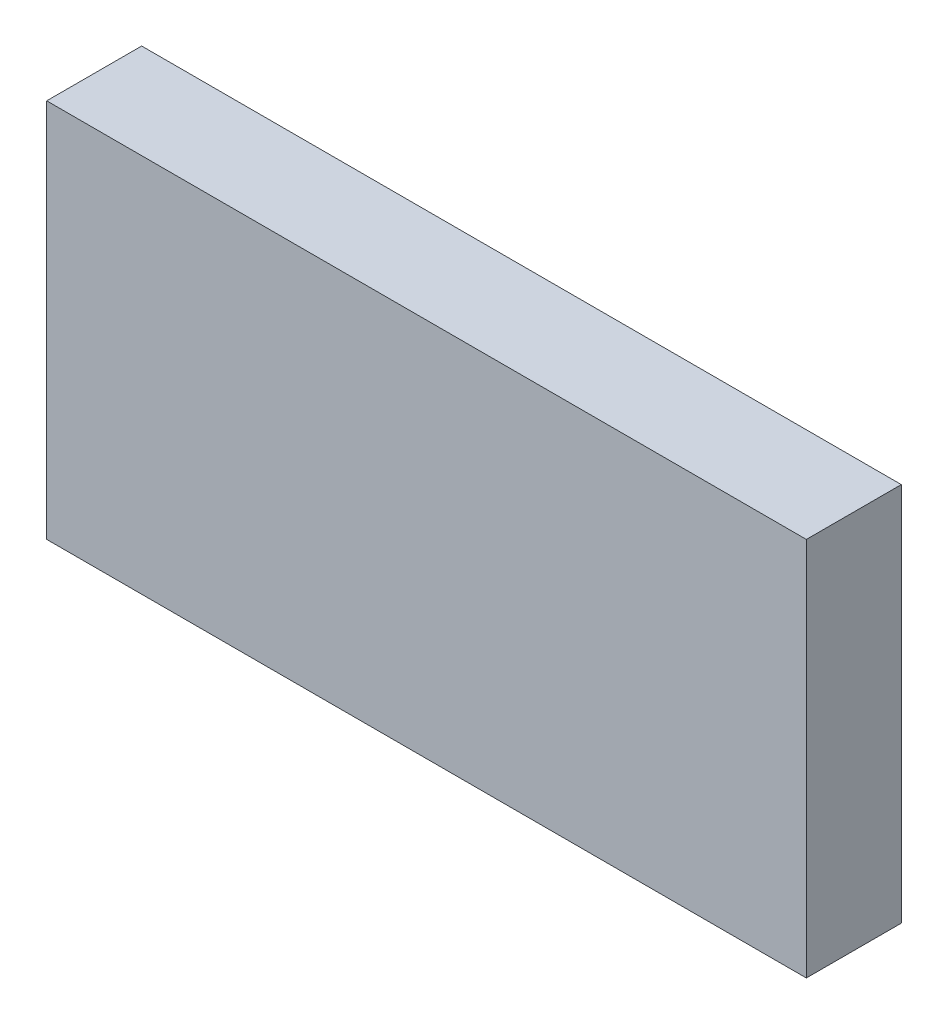
ISO-10303-21;
HEADER;
FILE_DESCRIPTION(('STEP AP214'),'2;1');
FILE_NAME('part.step','',(''),(''),'','','');
FILE_SCHEMA(('AUTOMOTIVE_DESIGN { 1 0 10303 214 1 1 1 1 }'));
ENDSEC;
DATA;
#1=APPLICATION_CONTEXT('core data for automotive mechanical design processes');
#2=APPLICATION_PROTOCOL_DEFINITION('international standard','automotive_design',2000,#1);
#3=PRODUCT_CONTEXT('',#1,'mechanical');
#4=PRODUCT('Part','Part','',(#3));
#5=PRODUCT_RELATED_PRODUCT_CATEGORY('part','',(#4));
#6=PRODUCT_DEFINITION_FORMATION('','',#4);
#7=PRODUCT_DEFINITION_CONTEXT('part definition',#1,'design');
#8=PRODUCT_DEFINITION('design','',#6,#7);
#9=PRODUCT_DEFINITION_SHAPE('','',#8);
#10=(LENGTH_UNIT() NAMED_UNIT(*) SI_UNIT(.MILLI.,.METRE.));
#11=(NAMED_UNIT(*) PLANE_ANGLE_UNIT() SI_UNIT($,.RADIAN.));
#12=(NAMED_UNIT(*) SI_UNIT($,.STERADIAN.) SOLID_ANGLE_UNIT());
#13=UNCERTAINTY_MEASURE_WITH_UNIT(LENGTH_MEASURE(1.E-05),#10,'distance_accuracy_value','');
#14=(GEOMETRIC_REPRESENTATION_CONTEXT(3) GLOBAL_UNCERTAINTY_ASSIGNED_CONTEXT((#13)) GLOBAL_UNIT_ASSIGNED_CONTEXT((#10,
#11,#12)) REPRESENTATION_CONTEXT('',''));
#15=CARTESIAN_POINT('',(0.,0.,0.));
#16=DIRECTION('',(0.,0.,1.));
#17=DIRECTION('',(1.,0.,0.));
#18=AXIS2_PLACEMENT_3D('',#15,#16,#17);
#19=CARTESIAN_POINT('',(50.5858711935384,-184.,3.));
#20=DIRECTION('',(1.,0.,0.));
#21=DIRECTION('',(0.,1.,0.));
#22=AXIS2_PLACEMENT_3D('',#19,#20,#21);
#23=PLANE('',#22);
#24=DIRECTION('',(0.,-1.,0.));
#25=VECTOR('',#24,1.);
#26=CARTESIAN_POINT('',(50.5858711935384,-184.,0.));
#27=LINE('',#26,#25);
#28=CARTESIAN_POINT('',(50.5858711935384,-184.,0.));
#29=VERTEX_POINT('',#28);
#30=CARTESIAN_POINT('',(50.5858711935384,-196.,0.));
#31=VERTEX_POINT('',#30);
#32=EDGE_CURVE('E97',#29,#31,#27,.T.);
#33=ORIENTED_EDGE('',*,*,#32,.T.);
#34=DIRECTION('',(0.,0.,-1.));
#35=VECTOR('',#34,1.);
#36=CARTESIAN_POINT('',(50.5858711935384,-196.,3.));
#37=LINE('',#36,#35);
#38=CARTESIAN_POINT('',(50.5858711935384,-196.,3.));
#39=VERTEX_POINT('',#38);
#40=EDGE_CURVE('E11',#39,#31,#37,.T.);
#41=ORIENTED_EDGE('',*,*,#40,.F.);
#42=DIRECTION('',(0.,-1.,0.));
#43=VECTOR('',#42,1.);
#44=CARTESIAN_POINT('',(50.5858711935384,-184.,3.));
#45=LINE('',#44,#43);
#46=CARTESIAN_POINT('',(50.5858711935384,-184.,3.));
#47=VERTEX_POINT('',#46);
#48=EDGE_CURVE('E85',#47,#39,#45,.T.);
#49=ORIENTED_EDGE('',*,*,#48,.F.);
#50=DIRECTION('',(0.,0.,-1.));
#51=VECTOR('',#50,1.);
#52=CARTESIAN_POINT('',(50.5858711935384,-184.,3.));
#53=LINE('',#52,#51);
#54=EDGE_CURVE('E93',#47,#29,#53,.T.);
#55=ORIENTED_EDGE('',*,*,#54,.T.);
#56=EDGE_LOOP('',(#33,#41,#49,#55));
#57=FACE_BOUND('',#56,.T.);
#58=ADVANCED_FACE('F34',(#57),#23,.F.);
#59=CARTESIAN_POINT('',(50.5858711935384,-196.,3.));
#60=DIRECTION('',(0.,1.,0.));
#61=DIRECTION('',(0.,0.,1.));
#62=AXIS2_PLACEMENT_3D('',#59,#60,#61);
#63=PLANE('',#62);
#64=DIRECTION('',(1.,0.,0.));
#65=VECTOR('',#64,1.);
#66=CARTESIAN_POINT('',(50.5858711935384,-196.,0.));
#67=LINE('',#66,#65);
#68=CARTESIAN_POINT('',(74.5858711935384,-196.,0.));
#69=VERTEX_POINT('',#68);
#70=EDGE_CURVE('E89',#31,#69,#67,.T.);
#71=ORIENTED_EDGE('',*,*,#70,.T.);
#72=DIRECTION('',(0.,0.,-1.));
#73=VECTOR('',#72,1.);
#74=CARTESIAN_POINT('',(74.5858711935384,-196.,3.));
#75=LINE('',#74,#73);
#76=CARTESIAN_POINT('',(74.5858711935384,-196.,3.));
#77=VERTEX_POINT('',#76);
#78=EDGE_CURVE('E42',#77,#69,#75,.T.);
#79=ORIENTED_EDGE('',*,*,#78,.F.);
#80=DIRECTION('',(1.,0.,0.));
#81=VECTOR('',#80,1.);
#82=CARTESIAN_POINT('',(50.5858711935384,-196.,3.));
#83=LINE('',#82,#81);
#84=EDGE_CURVE('E80',#39,#77,#83,.T.);
#85=ORIENTED_EDGE('',*,*,#84,.F.);
#86=ORIENTED_EDGE('',*,*,#40,.T.);
#87=EDGE_LOOP('',(#71,#79,#85,#86));
#88=FACE_BOUND('',#87,.T.);
#89=ADVANCED_FACE('F88',(#88),#63,.F.);
#90=CARTESIAN_POINT('',(74.5858711935384,-184.,3.));
#91=DIRECTION('',(-1.,0.,0.));
#92=DIRECTION('',(0.,-1.,0.));
#93=AXIS2_PLACEMENT_3D('',#90,#91,#92);
#94=PLANE('',#93);
#95=DIRECTION('',(0.,1.,0.));
#96=VECTOR('',#95,1.);
#97=CARTESIAN_POINT('',(74.5858711935384,-184.,0.));
#98=LINE('',#97,#96);
#99=CARTESIAN_POINT('',(74.5858711935384,-184.,0.));
#100=VERTEX_POINT('',#99);
#101=EDGE_CURVE('E67',#69,#100,#98,.T.);
#102=ORIENTED_EDGE('',*,*,#101,.T.);
#103=DIRECTION('',(0.,0.,-1.));
#104=VECTOR('',#103,1.);
#105=CARTESIAN_POINT('',(74.5858711935384,-184.,3.));
#106=LINE('',#105,#104);
#107=CARTESIAN_POINT('',(74.5858711935384,-184.,3.));
#108=VERTEX_POINT('',#107);
#109=EDGE_CURVE('E90',#108,#100,#106,.T.);
#110=ORIENTED_EDGE('',*,*,#109,.F.);
#111=DIRECTION('',(0.,1.,0.));
#112=VECTOR('',#111,1.);
#113=CARTESIAN_POINT('',(74.5858711935384,-184.,3.));
#114=LINE('',#113,#112);
#115=EDGE_CURVE('E83',#77,#108,#114,.T.);
#116=ORIENTED_EDGE('',*,*,#115,.F.);
#117=ORIENTED_EDGE('',*,*,#78,.T.);
#118=EDGE_LOOP('',(#102,#110,#116,#117));
#119=FACE_BOUND('',#118,.T.);
#120=ADVANCED_FACE('F91',(#119),#94,.F.);
#121=CARTESIAN_POINT('',(50.5858711935384,-184.,3.));
#122=DIRECTION('',(0.,-1.,0.));
#123=DIRECTION('',(0.,0.,-1.));
#124=AXIS2_PLACEMENT_3D('',#121,#122,#123);
#125=PLANE('',#124);
#126=DIRECTION('',(-1.,0.,0.));
#127=VECTOR('',#126,1.);
#128=CARTESIAN_POINT('',(50.5858711935384,-184.,0.));
#129=LINE('',#128,#127);
#130=EDGE_CURVE('E73',#100,#29,#129,.T.);
#131=ORIENTED_EDGE('',*,*,#130,.T.);
#132=ORIENTED_EDGE('',*,*,#54,.F.);
#133=DIRECTION('',(-1.,0.,0.));
#134=VECTOR('',#133,1.);
#135=CARTESIAN_POINT('',(50.5858711935384,-184.,3.));
#136=LINE('',#135,#134);
#137=EDGE_CURVE('E50',#108,#47,#136,.T.);
#138=ORIENTED_EDGE('',*,*,#137,.F.);
#139=ORIENTED_EDGE('',*,*,#109,.T.);
#140=EDGE_LOOP('',(#131,#132,#138,#139));
#141=FACE_BOUND('',#140,.T.);
#142=ADVANCED_FACE('F104',(#141),#125,.F.);
#143=CARTESIAN_POINT('',(0.,0.,3.));
#144=DIRECTION('',(0.,0.,1.));
#145=DIRECTION('',(1.,0.,0.));
#146=AXIS2_PLACEMENT_3D('',#143,#144,#145);
#147=PLANE('',#146);
#148=ORIENTED_EDGE('',*,*,#48,.T.);
#149=ORIENTED_EDGE('',*,*,#84,.T.);
#150=ORIENTED_EDGE('',*,*,#115,.T.);
#151=ORIENTED_EDGE('',*,*,#137,.T.);
#152=EDGE_LOOP('',(#148,#149,#150,#151));
#153=FACE_BOUND('',#152,.T.);
#154=ADVANCED_FACE('F81',(#153),#147,.T.);
#155=CARTESIAN_POINT('',(0.,0.,0.));
#156=DIRECTION('',(0.,0.,1.));
#157=DIRECTION('',(1.,0.,0.));
#158=AXIS2_PLACEMENT_3D('',#155,#156,#157);
#159=PLANE('',#158);
#160=ORIENTED_EDGE('',*,*,#32,.F.);
#161=ORIENTED_EDGE('',*,*,#130,.F.);
#162=ORIENTED_EDGE('',*,*,#101,.F.);
#163=ORIENTED_EDGE('',*,*,#70,.F.);
#164=EDGE_LOOP('',(#160,#161,#162,#163));
#165=FACE_BOUND('',#164,.T.);
#166=ADVANCED_FACE('F107',(#165),#159,.F.);
#167=CLOSED_SHELL('',(#58,#89,#120,#142,#154,#166));
#168=MANIFOLD_SOLID_BREP('B2',#167);
#169=ADVANCED_BREP_SHAPE_REPRESENTATION('',(#18,#168),#14);
#170=SHAPE_DEFINITION_REPRESENTATION(#9,#169);
ENDSEC;
END-ISO-10303-21;
